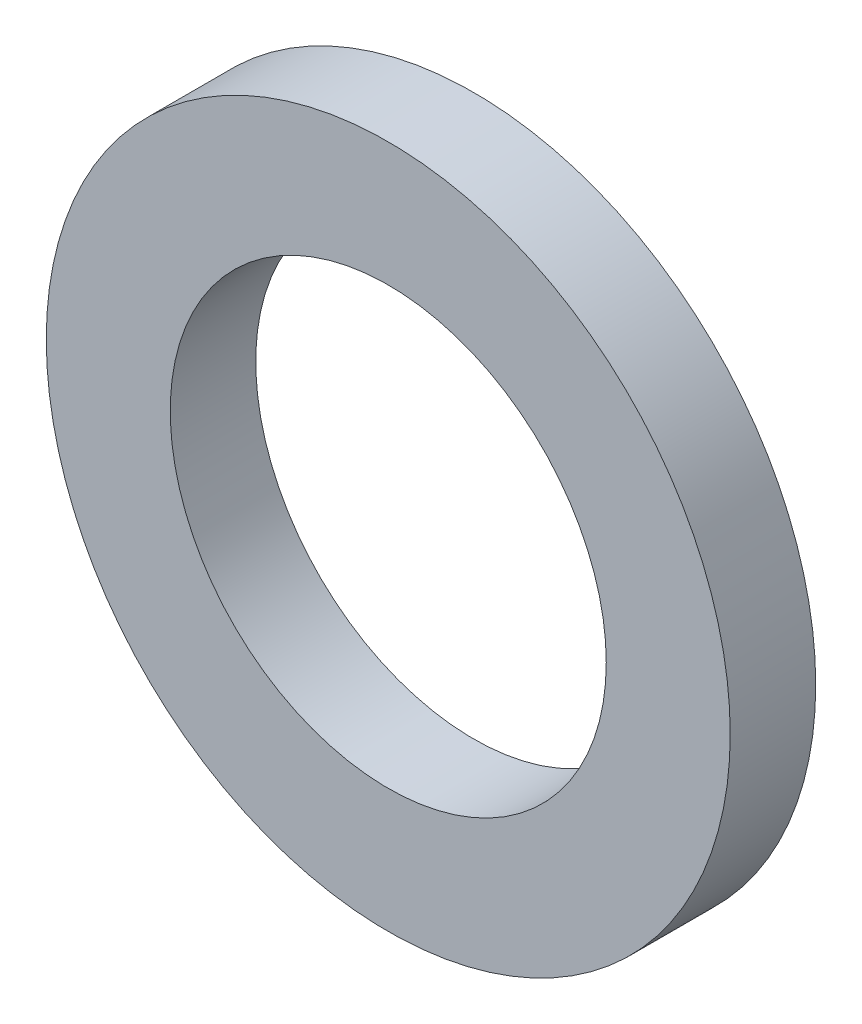
ISO-10303-21;
HEADER;
FILE_DESCRIPTION(('STEP AP214'),'2;1');
FILE_NAME('part.step','',(''),(''),'','','');
FILE_SCHEMA(('AUTOMOTIVE_DESIGN { 1 0 10303 214 1 1 1 1 }'));
ENDSEC;
DATA;
#1=APPLICATION_CONTEXT('core data for automotive mechanical design processes');
#2=APPLICATION_PROTOCOL_DEFINITION('international standard','automotive_design',2000,#1);
#3=PRODUCT_CONTEXT('',#1,'mechanical');
#4=PRODUCT('Part','Part','',(#3));
#5=PRODUCT_RELATED_PRODUCT_CATEGORY('part','',(#4));
#6=PRODUCT_DEFINITION_FORMATION('','',#4);
#7=PRODUCT_DEFINITION_CONTEXT('part definition',#1,'design');
#8=PRODUCT_DEFINITION('design','',#6,#7);
#9=PRODUCT_DEFINITION_SHAPE('','',#8);
#10=(LENGTH_UNIT() NAMED_UNIT(*) SI_UNIT(.MILLI.,.METRE.));
#11=(NAMED_UNIT(*) PLANE_ANGLE_UNIT() SI_UNIT($,.RADIAN.));
#12=(NAMED_UNIT(*) SI_UNIT($,.STERADIAN.) SOLID_ANGLE_UNIT());
#13=UNCERTAINTY_MEASURE_WITH_UNIT(LENGTH_MEASURE(1.E-05),#10,'distance_accuracy_value','');
#14=(GEOMETRIC_REPRESENTATION_CONTEXT(3) GLOBAL_UNCERTAINTY_ASSIGNED_CONTEXT((#13)) GLOBAL_UNIT_ASSIGNED_CONTEXT((#10,
#11,#12)) REPRESENTATION_CONTEXT('',''));
#15=CARTESIAN_POINT('',(0.,0.,0.));
#16=DIRECTION('',(0.,0.,1.));
#17=DIRECTION('',(1.,0.,0.));
#18=AXIS2_PLACEMENT_3D('',#15,#16,#17);
#19=CARTESIAN_POINT('',(0.,0.,1.));
#20=DIRECTION('',(0.,0.,1.));
#21=DIRECTION('',(1.,0.,0.));
#22=AXIS2_PLACEMENT_3D('',#19,#20,#21);
#23=PLANE('',#22);
#24=CARTESIAN_POINT('',(0.,0.,1.));
#25=DIRECTION('',(0.,0.,1.));
#26=DIRECTION('',(1.,0.,0.));
#27=AXIS2_PLACEMENT_3D('',#24,#25,#26);
#28=CIRCLE('',#27,4.);
#29=CARTESIAN_POINT('',(4.,0.,1.));
#30=VERTEX_POINT('',#29);
#31=EDGE_CURVE('E10',#30,#30,#28,.T.);
#32=ORIENTED_EDGE('',*,*,#31,.T.);
#33=EDGE_LOOP('',(#32));
#34=FACE_BOUND('',#33,.T.);
#35=CARTESIAN_POINT('',(0.,0.,1.));
#36=DIRECTION('',(0.,0.,1.));
#37=DIRECTION('',(1.,0.,0.));
#38=AXIS2_PLACEMENT_3D('',#35,#36,#37);
#39=CIRCLE('',#38,2.55);
#40=CARTESIAN_POINT('',(2.55,0.,1.));
#41=VERTEX_POINT('',#40);
#42=EDGE_CURVE('E43',#41,#41,#39,.T.);
#43=ORIENTED_EDGE('',*,*,#42,.F.);
#44=EDGE_LOOP('',(#43));
#45=FACE_BOUND('',#44,.T.);
#46=ADVANCED_FACE('F32',(#34,#45),#23,.T.);
#47=CARTESIAN_POINT('',(0.,0.,0.));
#48=DIRECTION('',(0.,0.,1.));
#49=DIRECTION('',(1.,0.,0.));
#50=AXIS2_PLACEMENT_3D('',#47,#48,#49);
#51=PLANE('',#50);
#52=CARTESIAN_POINT('',(0.,0.,0.));
#53=DIRECTION('',(0.,0.,1.));
#54=DIRECTION('',(1.,0.,0.));
#55=AXIS2_PLACEMENT_3D('',#52,#53,#54);
#56=CIRCLE('',#55,4.);
#57=CARTESIAN_POINT('',(4.,0.,0.));
#58=VERTEX_POINT('',#57);
#59=EDGE_CURVE('E36',#58,#58,#56,.T.);
#60=ORIENTED_EDGE('',*,*,#59,.F.);
#61=EDGE_LOOP('',(#60));
#62=FACE_BOUND('',#61,.T.);
#63=CARTESIAN_POINT('',(0.,0.,0.));
#64=DIRECTION('',(0.,0.,1.));
#65=DIRECTION('',(1.,0.,0.));
#66=AXIS2_PLACEMENT_3D('',#63,#64,#65);
#67=CIRCLE('',#66,2.55);
#68=CARTESIAN_POINT('',(2.55,0.,0.));
#69=VERTEX_POINT('',#68);
#70=EDGE_CURVE('E45',#69,#69,#67,.T.);
#71=ORIENTED_EDGE('',*,*,#70,.T.);
#72=EDGE_LOOP('',(#71));
#73=FACE_BOUND('',#72,.T.);
#74=ADVANCED_FACE('F55',(#62,#73),#51,.F.);
#75=CARTESIAN_POINT('',(0.,0.,1.));
#76=DIRECTION('',(0.,0.,-1.));
#77=DIRECTION('',(-1.,0.,0.));
#78=AXIS2_PLACEMENT_3D('',#75,#76,#77);
#79=CYLINDRICAL_SURFACE('',#78,4.);
#80=ORIENTED_EDGE('',*,*,#31,.F.);
#81=EDGE_LOOP('',(#80));
#82=FACE_BOUND('',#81,.T.);
#83=ORIENTED_EDGE('',*,*,#59,.T.);
#84=EDGE_LOOP('',(#83));
#85=FACE_BOUND('',#84,.T.);
#86=ADVANCED_FACE('F34',(#82,#85),#79,.T.);
#87=CARTESIAN_POINT('',(0.,0.,1.));
#88=DIRECTION('',(0.,0.,-1.));
#89=DIRECTION('',(-1.,0.,0.));
#90=AXIS2_PLACEMENT_3D('',#87,#88,#89);
#91=CYLINDRICAL_SURFACE('',#90,2.55);
#92=ORIENTED_EDGE('',*,*,#42,.T.);
#93=EDGE_LOOP('',(#92));
#94=FACE_BOUND('',#93,.T.);
#95=ORIENTED_EDGE('',*,*,#70,.F.);
#96=EDGE_LOOP('',(#95));
#97=FACE_BOUND('',#96,.T.);
#98=ADVANCED_FACE('F51',(#94,#97),#91,.F.);
#99=CLOSED_SHELL('',(#46,#74,#86,#98));
#100=MANIFOLD_SOLID_BREP('B2',#99);
#101=ADVANCED_BREP_SHAPE_REPRESENTATION('',(#18,#100),#14);
#102=SHAPE_DEFINITION_REPRESENTATION(#9,#101);
ENDSEC;
END-ISO-10303-21;
